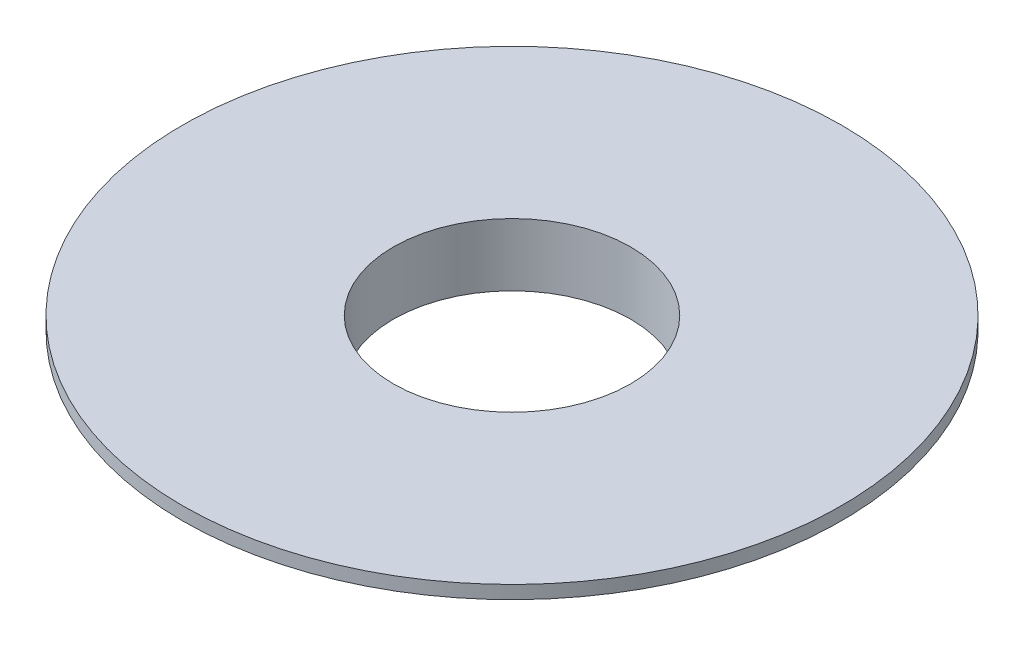
ISO-10303-21;
HEADER;
FILE_DESCRIPTION(('STEP AP214'),'2;1');
FILE_NAME('part.step','',(''),(''),'','','');
FILE_SCHEMA(('AUTOMOTIVE_DESIGN { 1 0 10303 214 1 1 1 1 }'));
ENDSEC;
DATA;
#1=APPLICATION_CONTEXT('core data for automotive mechanical design processes');
#2=APPLICATION_PROTOCOL_DEFINITION('international standard','automotive_design',2000,#1);
#3=PRODUCT_CONTEXT('',#1,'mechanical');
#4=PRODUCT('Part','Part','',(#3));
#5=PRODUCT_RELATED_PRODUCT_CATEGORY('part','',(#4));
#6=PRODUCT_DEFINITION_FORMATION('','',#4);
#7=PRODUCT_DEFINITION_CONTEXT('part definition',#1,'design');
#8=PRODUCT_DEFINITION('design','',#6,#7);
#9=PRODUCT_DEFINITION_SHAPE('','',#8);
#10=(LENGTH_UNIT() NAMED_UNIT(*) SI_UNIT(.MILLI.,.METRE.));
#11=(NAMED_UNIT(*) PLANE_ANGLE_UNIT() SI_UNIT($,.RADIAN.));
#12=(NAMED_UNIT(*) SI_UNIT($,.STERADIAN.) SOLID_ANGLE_UNIT());
#13=UNCERTAINTY_MEASURE_WITH_UNIT(LENGTH_MEASURE(1.E-05),#10,'distance_accuracy_value','');
#14=(GEOMETRIC_REPRESENTATION_CONTEXT(3) GLOBAL_UNCERTAINTY_ASSIGNED_CONTEXT((#13)) GLOBAL_UNIT_ASSIGNED_CONTEXT((#10,
#11,#12)) REPRESENTATION_CONTEXT('',''));
#15=CARTESIAN_POINT('',(0.,0.,0.));
#16=DIRECTION('',(0.,0.,1.));
#17=DIRECTION('',(1.,0.,0.));
#18=AXIS2_PLACEMENT_3D('',#15,#16,#17);
#19=CARTESIAN_POINT('',(50.,-6.83748173714,0.));
#20=DIRECTION('',(0.,-1.,0.));
#21=DIRECTION('',(0.,0.,-1.));
#22=AXIS2_PLACEMENT_3D('',#19,#20,#21);
#23=PLANE('',#22);
#24=CARTESIAN_POINT('',(0.,-6.83748173714,0.));
#25=DIRECTION('',(0.,1.,0.));
#26=DIRECTION('',(0.,0.,1.));
#27=AXIS2_PLACEMENT_3D('',#24,#25,#26);
#28=CIRCLE('',#27,22.);
#29=CARTESIAN_POINT('',(0.,-6.83748173714,22.));
#30=VERTEX_POINT('',#29);
#31=EDGE_CURVE('E56',#30,#30,#28,.T.);
#32=ORIENTED_EDGE('',*,*,#31,.T.);
#33=EDGE_LOOP('',(#32));
#34=FACE_BOUND('',#33,.T.);
#35=CARTESIAN_POINT('',(0.,-6.83748173714,0.));
#36=DIRECTION('',(0.,1.,0.));
#37=DIRECTION('',(0.,0.,1.));
#38=AXIS2_PLACEMENT_3D('',#35,#36,#37);
#39=CIRCLE('',#38,50.);
#40=CARTESIAN_POINT('',(0.,-6.83748173714,50.));
#41=VERTEX_POINT('',#40);
#42=EDGE_CURVE('E10',#41,#41,#39,.T.);
#43=ORIENTED_EDGE('',*,*,#42,.F.);
#44=EDGE_LOOP('',(#43));
#45=FACE_BOUND('',#44,.T.);
#46=ADVANCED_FACE('F34',(#34,#45),#23,.T.);
#47=CARTESIAN_POINT('',(0.,-14.3374817371,0.));
#48=DIRECTION('',(0.,1.,0.));
#49=DIRECTION('',(0.,0.,1.));
#50=AXIS2_PLACEMENT_3D('',#47,#48,#49);
#51=CYLINDRICAL_SURFACE('',#50,50.);
#52=ORIENTED_EDGE('',*,*,#42,.T.);
#53=EDGE_LOOP('',(#52));
#54=FACE_BOUND('',#53,.T.);
#55=CARTESIAN_POINT('',(0.,-4.83748173714,0.));
#56=DIRECTION('',(0.,1.,0.));
#57=DIRECTION('',(0.,0.,1.));
#58=AXIS2_PLACEMENT_3D('',#55,#56,#57);
#59=CIRCLE('',#58,50.);
#60=CARTESIAN_POINT('',(0.,-4.83748173714,50.));
#61=VERTEX_POINT('',#60);
#62=EDGE_CURVE('E40',#61,#61,#59,.T.);
#63=ORIENTED_EDGE('',*,*,#62,.F.);
#64=EDGE_LOOP('',(#63));
#65=FACE_BOUND('',#64,.T.);
#66=ADVANCED_FACE('F74',(#54,#65),#51,.T.);
#67=CARTESIAN_POINT('',(18.,-4.83748173714,0.));
#68=DIRECTION('',(0.,1.,0.));
#69=DIRECTION('',(0.,0.,1.));
#70=AXIS2_PLACEMENT_3D('',#67,#68,#69);
#71=PLANE('',#70);
#72=ORIENTED_EDGE('',*,*,#62,.T.);
#73=EDGE_LOOP('',(#72));
#74=FACE_BOUND('',#73,.T.);
#75=CARTESIAN_POINT('',(0.,-4.83748173714,0.));
#76=DIRECTION('',(0.,1.,0.));
#77=DIRECTION('',(0.,0.,1.));
#78=AXIS2_PLACEMENT_3D('',#75,#76,#77);
#79=CIRCLE('',#78,18.);
#80=CARTESIAN_POINT('',(0.,-4.83748173714,18.));
#81=VERTEX_POINT('',#80);
#82=EDGE_CURVE('E44',#81,#81,#79,.T.);
#83=ORIENTED_EDGE('',*,*,#82,.F.);
#84=EDGE_LOOP('',(#83));
#85=FACE_BOUND('',#84,.T.);
#86=ADVANCED_FACE('F78',(#74,#85),#71,.T.);
#87=CARTESIAN_POINT('',(0.,-14.3374817371,0.));
#88=DIRECTION('',(0.,1.,0.));
#89=DIRECTION('',(0.,0.,1.));
#90=AXIS2_PLACEMENT_3D('',#87,#88,#89);
#91=CYLINDRICAL_SURFACE('',#90,18.);
#92=ORIENTED_EDGE('',*,*,#82,.T.);
#93=EDGE_LOOP('',(#92));
#94=FACE_BOUND('',#93,.T.);
#95=CARTESIAN_POINT('',(0.,-14.3374817371,0.));
#96=DIRECTION('',(0.,1.,0.));
#97=DIRECTION('',(0.,0.,1.));
#98=AXIS2_PLACEMENT_3D('',#95,#96,#97);
#99=CIRCLE('',#98,18.);
#100=CARTESIAN_POINT('',(0.,-14.3374817371,18.));
#101=VERTEX_POINT('',#100);
#102=EDGE_CURVE('E48',#101,#101,#99,.T.);
#103=ORIENTED_EDGE('',*,*,#102,.F.);
#104=EDGE_LOOP('',(#103));
#105=FACE_BOUND('',#104,.T.);
#106=ADVANCED_FACE('F70',(#94,#105),#91,.F.);
#107=CARTESIAN_POINT('',(22.,-14.3374817371,0.));
#108=DIRECTION('',(0.,-1.,0.));
#109=DIRECTION('',(0.,0.,-1.));
#110=AXIS2_PLACEMENT_3D('',#107,#108,#109);
#111=PLANE('',#110);
#112=ORIENTED_EDGE('',*,*,#102,.T.);
#113=EDGE_LOOP('',(#112));
#114=FACE_BOUND('',#113,.T.);
#115=CARTESIAN_POINT('',(0.,-14.3374817371,0.));
#116=DIRECTION('',(0.,1.,0.));
#117=DIRECTION('',(0.,0.,1.));
#118=AXIS2_PLACEMENT_3D('',#115,#116,#117);
#119=CIRCLE('',#118,22.);
#120=CARTESIAN_POINT('',(0.,-14.3374817371,22.));
#121=VERTEX_POINT('',#120);
#122=EDGE_CURVE('E53',#121,#121,#119,.T.);
#123=ORIENTED_EDGE('',*,*,#122,.F.);
#124=EDGE_LOOP('',(#123));
#125=FACE_BOUND('',#124,.T.);
#126=ADVANCED_FACE('F64',(#114,#125),#111,.T.);
#127=CARTESIAN_POINT('',(0.,-14.3374817371,0.));
#128=DIRECTION('',(0.,1.,0.));
#129=DIRECTION('',(0.,0.,1.));
#130=AXIS2_PLACEMENT_3D('',#127,#128,#129);
#131=CYLINDRICAL_SURFACE('',#130,22.);
#132=ORIENTED_EDGE('',*,*,#122,.T.);
#133=EDGE_LOOP('',(#132));
#134=FACE_BOUND('',#133,.T.);
#135=ORIENTED_EDGE('',*,*,#31,.F.);
#136=EDGE_LOOP('',(#135));
#137=FACE_BOUND('',#136,.T.);
#138=ADVANCED_FACE('F62',(#134,#137),#131,.T.);
#139=CLOSED_SHELL('',(#46,#66,#86,#106,#126,#138));
#140=MANIFOLD_SOLID_BREP('B2',#139);
#141=ADVANCED_BREP_SHAPE_REPRESENTATION('',(#18,#140),#14);
#142=SHAPE_DEFINITION_REPRESENTATION(#9,#141);
ENDSEC;
END-ISO-10303-21;
